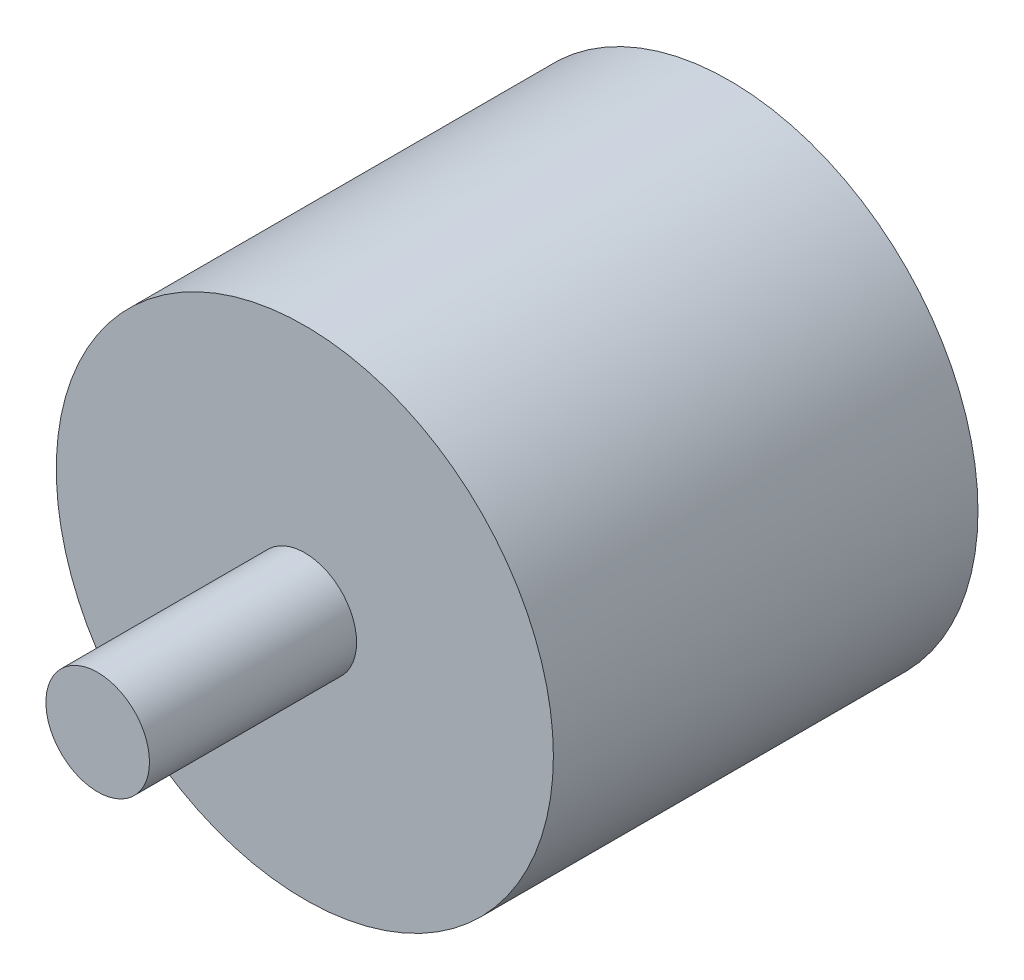
ISO-10303-21;
HEADER;
FILE_DESCRIPTION(('STEP AP214'),'2;1');
FILE_NAME('part.step','',(''),(''),'','','');
FILE_SCHEMA(('AUTOMOTIVE_DESIGN { 1 0 10303 214 1 1 1 1 }'));
ENDSEC;
DATA;
#1=APPLICATION_CONTEXT('core data for automotive mechanical design processes');
#2=APPLICATION_PROTOCOL_DEFINITION('international standard','automotive_design',2000,#1);
#3=PRODUCT_CONTEXT('',#1,'mechanical');
#4=PRODUCT('Part','Part','',(#3));
#5=PRODUCT_RELATED_PRODUCT_CATEGORY('part','',(#4));
#6=PRODUCT_DEFINITION_FORMATION('','',#4);
#7=PRODUCT_DEFINITION_CONTEXT('part definition',#1,'design');
#8=PRODUCT_DEFINITION('design','',#6,#7);
#9=PRODUCT_DEFINITION_SHAPE('','',#8);
#10=(LENGTH_UNIT() NAMED_UNIT(*) SI_UNIT(.MILLI.,.METRE.));
#11=(NAMED_UNIT(*) PLANE_ANGLE_UNIT() SI_UNIT($,.RADIAN.));
#12=(NAMED_UNIT(*) SI_UNIT($,.STERADIAN.) SOLID_ANGLE_UNIT());
#13=UNCERTAINTY_MEASURE_WITH_UNIT(LENGTH_MEASURE(1.E-05),#10,'distance_accuracy_value','');
#14=(GEOMETRIC_REPRESENTATION_CONTEXT(3) GLOBAL_UNCERTAINTY_ASSIGNED_CONTEXT((#13)) GLOBAL_UNIT_ASSIGNED_CONTEXT((#10,
#11,#12)) REPRESENTATION_CONTEXT('',''));
#15=CARTESIAN_POINT('',(0.,0.,0.));
#16=DIRECTION('',(0.,0.,1.));
#17=DIRECTION('',(1.,0.,0.));
#18=AXIS2_PLACEMENT_3D('',#15,#16,#17);
#19=CARTESIAN_POINT('',(0.,0.,20.5));
#20=DIRECTION('',(0.,0.,-1.));
#21=DIRECTION('',(-1.,0.,0.));
#22=AXIS2_PLACEMENT_3D('',#19,#20,#21);
#23=CYLINDRICAL_SURFACE('',#22,12.);
#24=CARTESIAN_POINT('',(0.,0.,20.5));
#25=DIRECTION('',(0.,0.,1.));
#26=DIRECTION('',(1.,0.,0.));
#27=AXIS2_PLACEMENT_3D('',#24,#25,#26);
#28=CIRCLE('',#27,12.);
#29=CARTESIAN_POINT('',(12.,0.,20.5));
#30=VERTEX_POINT('',#29);
#31=EDGE_CURVE('E37',#30,#30,#28,.T.);
#32=ORIENTED_EDGE('',*,*,#31,.F.);
#33=EDGE_LOOP('',(#32));
#34=FACE_BOUND('',#33,.T.);
#35=CARTESIAN_POINT('',(0.,0.,0.));
#36=DIRECTION('',(0.,0.,1.));
#37=DIRECTION('',(1.,0.,0.));
#38=AXIS2_PLACEMENT_3D('',#35,#36,#37);
#39=CIRCLE('',#38,12.);
#40=CARTESIAN_POINT('',(12.,0.,0.));
#41=VERTEX_POINT('',#40);
#42=EDGE_CURVE('E33',#41,#41,#39,.T.);
#43=ORIENTED_EDGE('',*,*,#42,.T.);
#44=EDGE_LOOP('',(#43));
#45=FACE_BOUND('',#44,.T.);
#46=ADVANCED_FACE('F30',(#34,#45),#23,.T.);
#47=CARTESIAN_POINT('',(0.,0.,20.5));
#48=DIRECTION('',(0.,0.,1.));
#49=DIRECTION('',(1.,0.,0.));
#50=AXIS2_PLACEMENT_3D('',#47,#48,#49);
#51=PLANE('',#50);
#52=CARTESIAN_POINT('',(0.,0.,20.5));
#53=DIRECTION('',(0.,0.,1.));
#54=DIRECTION('',(1.,0.,0.));
#55=AXIS2_PLACEMENT_3D('',#52,#53,#54);
#56=CIRCLE('',#55,2.5);
#57=CARTESIAN_POINT('',(2.5,0.,20.5));
#58=VERTEX_POINT('',#57);
#59=EDGE_CURVE('E10',#58,#58,#56,.T.);
#60=ORIENTED_EDGE('',*,*,#59,.F.);
#61=EDGE_LOOP('',(#60));
#62=FACE_BOUND('',#61,.T.);
#63=ORIENTED_EDGE('',*,*,#31,.T.);
#64=EDGE_LOOP('',(#63));
#65=FACE_BOUND('',#64,.T.);
#66=ADVANCED_FACE('F54',(#62,#65),#51,.T.);
#67=CARTESIAN_POINT('',(0.,0.,0.));
#68=DIRECTION('',(0.,0.,1.));
#69=DIRECTION('',(1.,0.,0.));
#70=AXIS2_PLACEMENT_3D('',#67,#68,#69);
#71=PLANE('',#70);
#72=ORIENTED_EDGE('',*,*,#42,.F.);
#73=EDGE_LOOP('',(#72));
#74=FACE_BOUND('',#73,.T.);
#75=ADVANCED_FACE('F51',(#74),#71,.F.);
#76=CARTESIAN_POINT('',(0.,0.,30.5));
#77=DIRECTION('',(0.,0.,-1.));
#78=DIRECTION('',(-1.,0.,0.));
#79=AXIS2_PLACEMENT_3D('',#76,#77,#78);
#80=CYLINDRICAL_SURFACE('',#79,2.5);
#81=CARTESIAN_POINT('',(0.,0.,30.5));
#82=DIRECTION('',(0.,0.,1.));
#83=DIRECTION('',(1.,0.,0.));
#84=AXIS2_PLACEMENT_3D('',#81,#82,#83);
#85=CIRCLE('',#84,2.5);
#86=CARTESIAN_POINT('',(2.5,0.,30.5));
#87=VERTEX_POINT('',#86);
#88=EDGE_CURVE('E43',#87,#87,#85,.T.);
#89=ORIENTED_EDGE('',*,*,#88,.F.);
#90=EDGE_LOOP('',(#89));
#91=FACE_BOUND('',#90,.T.);
#92=ORIENTED_EDGE('',*,*,#59,.T.);
#93=EDGE_LOOP('',(#92));
#94=FACE_BOUND('',#93,.T.);
#95=ADVANCED_FACE('F53',(#91,#94),#80,.T.);
#96=CARTESIAN_POINT('',(0.,0.,30.5));
#97=DIRECTION('',(0.,0.,1.));
#98=DIRECTION('',(1.,0.,0.));
#99=AXIS2_PLACEMENT_3D('',#96,#97,#98);
#100=PLANE('',#99);
#101=ORIENTED_EDGE('',*,*,#88,.T.);
#102=EDGE_LOOP('',(#101));
#103=FACE_BOUND('',#102,.T.);
#104=ADVANCED_FACE('F59',(#103),#100,.T.);
#105=CLOSED_SHELL('',(#46,#66,#75,#95,#104));
#106=MANIFOLD_SOLID_BREP('B2',#105);
#107=ADVANCED_BREP_SHAPE_REPRESENTATION('',(#18,#106),#14);
#108=SHAPE_DEFINITION_REPRESENTATION(#9,#107);
ENDSEC;
END-ISO-10303-21;
